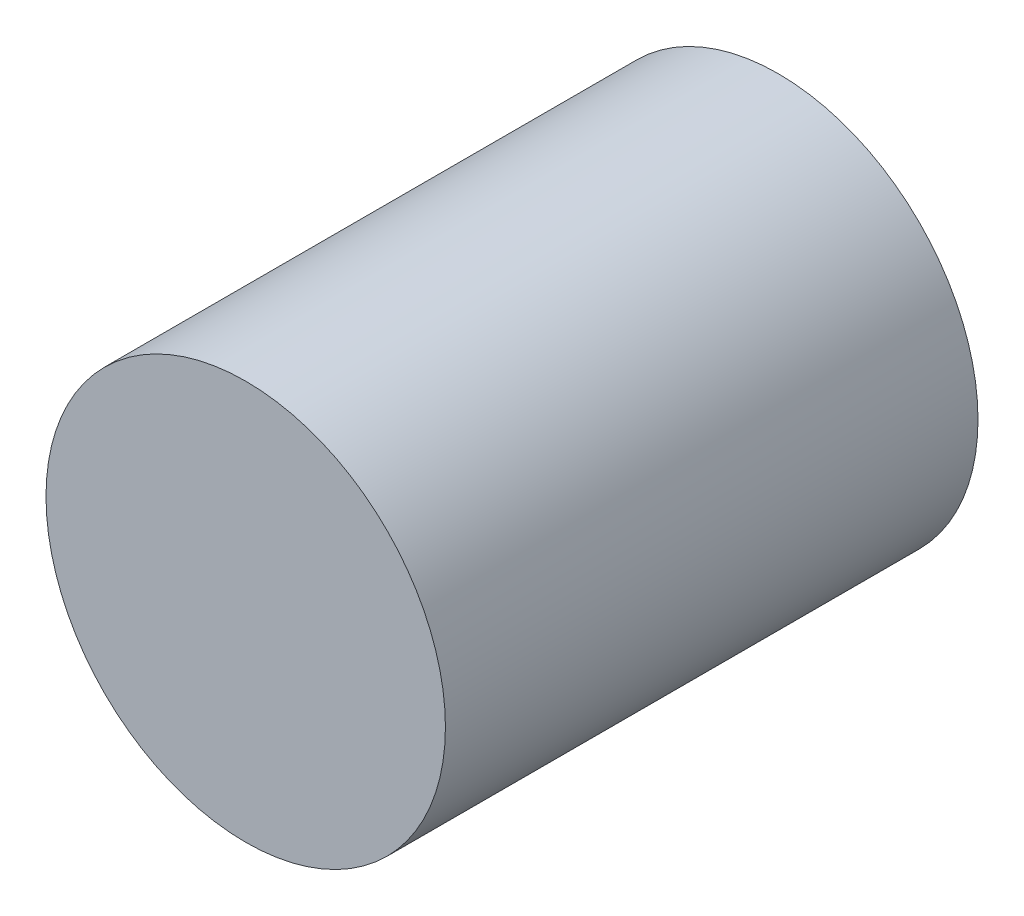
ISO-10303-21;
HEADER;
FILE_DESCRIPTION(('STEP AP214'),'2;1');
FILE_NAME('part.step','',(''),(''),'','','');
FILE_SCHEMA(('AUTOMOTIVE_DESIGN { 1 0 10303 214 1 1 1 1 }'));
ENDSEC;
DATA;
#1=APPLICATION_CONTEXT('core data for automotive mechanical design processes');
#2=APPLICATION_PROTOCOL_DEFINITION('international standard','automotive_design',2000,#1);
#3=PRODUCT_CONTEXT('',#1,'mechanical');
#4=PRODUCT('Part','Part','',(#3));
#5=PRODUCT_RELATED_PRODUCT_CATEGORY('part','',(#4));
#6=PRODUCT_DEFINITION_FORMATION('','',#4);
#7=PRODUCT_DEFINITION_CONTEXT('part definition',#1,'design');
#8=PRODUCT_DEFINITION('design','',#6,#7);
#9=PRODUCT_DEFINITION_SHAPE('','',#8);
#10=(LENGTH_UNIT() NAMED_UNIT(*) SI_UNIT(.MILLI.,.METRE.));
#11=(NAMED_UNIT(*) PLANE_ANGLE_UNIT() SI_UNIT($,.RADIAN.));
#12=(NAMED_UNIT(*) SI_UNIT($,.STERADIAN.) SOLID_ANGLE_UNIT());
#13=UNCERTAINTY_MEASURE_WITH_UNIT(LENGTH_MEASURE(1.E-05),#10,'distance_accuracy_value','');
#14=(GEOMETRIC_REPRESENTATION_CONTEXT(3) GLOBAL_UNCERTAINTY_ASSIGNED_CONTEXT((#13)) GLOBAL_UNIT_ASSIGNED_CONTEXT((#10,
#11,#12)) REPRESENTATION_CONTEXT('',''));
#15=CARTESIAN_POINT('',(0.,0.,0.));
#16=DIRECTION('',(0.,0.,1.));
#17=DIRECTION('',(1.,0.,0.));
#18=AXIS2_PLACEMENT_3D('',#15,#16,#17);
#19=CARTESIAN_POINT('',(0.,0.,50.8));
#20=DIRECTION('',(0.,0.,-1.));
#21=DIRECTION('',(-1.,0.,0.));
#22=AXIS2_PLACEMENT_3D('',#19,#20,#21);
#23=CYLINDRICAL_SURFACE('',#22,19.05);
#24=CARTESIAN_POINT('',(0.,0.,50.8));
#25=DIRECTION('',(0.,0.,1.));
#26=DIRECTION('',(1.,0.,0.));
#27=AXIS2_PLACEMENT_3D('',#24,#25,#26);
#28=CIRCLE('',#27,19.05);
#29=CARTESIAN_POINT('',(19.05,0.,50.8));
#30=VERTEX_POINT('',#29);
#31=EDGE_CURVE('E10',#30,#30,#28,.T.);
#32=ORIENTED_EDGE('',*,*,#31,.F.);
#33=EDGE_LOOP('',(#32));
#34=FACE_BOUND('',#33,.T.);
#35=CARTESIAN_POINT('',(0.,0.,0.));
#36=DIRECTION('',(0.,0.,1.));
#37=DIRECTION('',(1.,0.,0.));
#38=AXIS2_PLACEMENT_3D('',#35,#36,#37);
#39=CIRCLE('',#38,19.05);
#40=CARTESIAN_POINT('',(19.05,0.,0.));
#41=VERTEX_POINT('',#40);
#42=EDGE_CURVE('E33',#41,#41,#39,.T.);
#43=ORIENTED_EDGE('',*,*,#42,.T.);
#44=EDGE_LOOP('',(#43));
#45=FACE_BOUND('',#44,.T.);
#46=ADVANCED_FACE('F30',(#34,#45),#23,.T.);
#47=CARTESIAN_POINT('',(0.,0.,50.8));
#48=DIRECTION('',(0.,0.,1.));
#49=DIRECTION('',(1.,0.,0.));
#50=AXIS2_PLACEMENT_3D('',#47,#48,#49);
#51=PLANE('',#50);
#52=ORIENTED_EDGE('',*,*,#31,.T.);
#53=EDGE_LOOP('',(#52));
#54=FACE_BOUND('',#53,.T.);
#55=ADVANCED_FACE('F45',(#54),#51,.T.);
#56=CARTESIAN_POINT('',(0.,0.,0.));
#57=DIRECTION('',(0.,0.,1.));
#58=DIRECTION('',(1.,0.,0.));
#59=AXIS2_PLACEMENT_3D('',#56,#57,#58);
#60=PLANE('',#59);
#61=ORIENTED_EDGE('',*,*,#42,.F.);
#62=EDGE_LOOP('',(#61));
#63=FACE_BOUND('',#62,.T.);
#64=ADVANCED_FACE('F43',(#63),#60,.F.);
#65=CLOSED_SHELL('',(#46,#55,#64));
#66=MANIFOLD_SOLID_BREP('B2',#65);
#67=ADVANCED_BREP_SHAPE_REPRESENTATION('',(#18,#66),#14);
#68=SHAPE_DEFINITION_REPRESENTATION(#9,#67);
ENDSEC;
END-ISO-10303-21;
